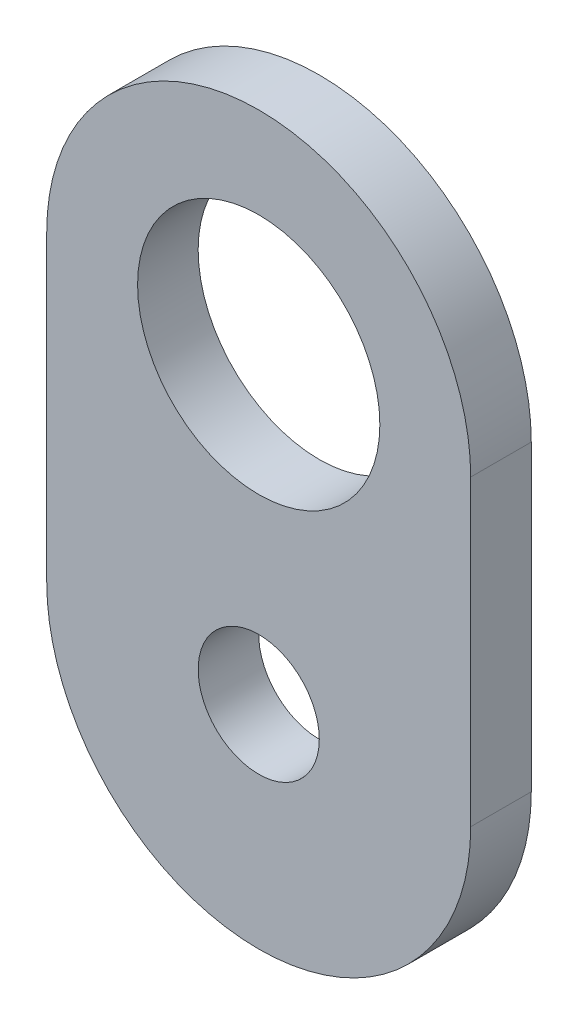
ISO-10303-21;
HEADER;
FILE_DESCRIPTION(('STEP AP214'),'2;1');
FILE_NAME('part.step','',(''),(''),'','','');
FILE_SCHEMA(('AUTOMOTIVE_DESIGN { 1 0 10303 214 1 1 1 1 }'));
ENDSEC;
DATA;
#1=APPLICATION_CONTEXT('core data for automotive mechanical design processes');
#2=APPLICATION_PROTOCOL_DEFINITION('international standard','automotive_design',2000,#1);
#3=PRODUCT_CONTEXT('',#1,'mechanical');
#4=PRODUCT('Part','Part','',(#3));
#5=PRODUCT_RELATED_PRODUCT_CATEGORY('part','',(#4));
#6=PRODUCT_DEFINITION_FORMATION('','',#4);
#7=PRODUCT_DEFINITION_CONTEXT('part definition',#1,'design');
#8=PRODUCT_DEFINITION('design','',#6,#7);
#9=PRODUCT_DEFINITION_SHAPE('','',#8);
#10=(LENGTH_UNIT() NAMED_UNIT(*) SI_UNIT(.MILLI.,.METRE.));
#11=(NAMED_UNIT(*) PLANE_ANGLE_UNIT() SI_UNIT($,.RADIAN.));
#12=(NAMED_UNIT(*) SI_UNIT($,.STERADIAN.) SOLID_ANGLE_UNIT());
#13=UNCERTAINTY_MEASURE_WITH_UNIT(LENGTH_MEASURE(1.E-05),#10,'distance_accuracy_value','');
#14=(GEOMETRIC_REPRESENTATION_CONTEXT(3) GLOBAL_UNCERTAINTY_ASSIGNED_CONTEXT((#13)) GLOBAL_UNIT_ASSIGNED_CONTEXT((#10,
#11,#12)) REPRESENTATION_CONTEXT('',''));
#15=CARTESIAN_POINT('',(0.,0.,0.));
#16=DIRECTION('',(0.,0.,1.));
#17=DIRECTION('',(1.,0.,0.));
#18=AXIS2_PLACEMENT_3D('',#15,#16,#17);
#19=CARTESIAN_POINT('',(0.,206.731564944869,12.7));
#20=DIRECTION('',(0.,0.,1.));
#21=DIRECTION('',(1.,0.,0.));
#22=AXIS2_PLACEMENT_3D('',#19,#20,#21);
#23=PLANE('',#22);
#24=CARTESIAN_POINT('',(0.,270.231564944869,12.7));
#25=DIRECTION('',(0.,0.,1.));
#26=DIRECTION('',(1.,0.,0.));
#27=AXIS2_PLACEMENT_3D('',#24,#25,#26);
#28=CIRCLE('',#27,25.4);
#29=CARTESIAN_POINT('',(25.4,270.231564944869,12.7));
#30=VERTEX_POINT('',#29);
#31=EDGE_CURVE('E117',#30,#30,#28,.T.);
#32=ORIENTED_EDGE('',*,*,#31,.F.);
#33=EDGE_LOOP('',(#32));
#34=FACE_BOUND('',#33,.T.);
#35=CARTESIAN_POINT('',(0.,206.731564944869,12.7));
#36=DIRECTION('',(0.,0.,1.));
#37=DIRECTION('',(1.,0.,0.));
#38=AXIS2_PLACEMENT_3D('',#35,#36,#37);
#39=CIRCLE('',#38,44.45);
#40=CARTESIAN_POINT('',(-44.45,206.731564944869,12.7));
#41=VERTEX_POINT('',#40);
#42=CARTESIAN_POINT('',(44.45,206.731564944869,12.7));
#43=VERTEX_POINT('',#42);
#44=EDGE_CURVE('E99',#41,#43,#39,.T.);
#45=ORIENTED_EDGE('',*,*,#44,.T.);
#46=DIRECTION('',(0.,1.,0.));
#47=VECTOR('',#46,1.);
#48=CARTESIAN_POINT('',(44.45,206.731564944869,12.7));
#49=LINE('',#48,#47);
#50=CARTESIAN_POINT('',(44.45,270.231564944869,12.7));
#51=VERTEX_POINT('',#50);
#52=EDGE_CURVE('E94',#43,#51,#49,.T.);
#53=ORIENTED_EDGE('',*,*,#52,.T.);
#54=CARTESIAN_POINT('',(0.,270.231564944869,12.7));
#55=DIRECTION('',(0.,0.,1.));
#56=DIRECTION('',(1.,0.,0.));
#57=AXIS2_PLACEMENT_3D('',#54,#55,#56);
#58=CIRCLE('',#57,44.45);
#59=CARTESIAN_POINT('',(-44.45,270.231564944869,12.7));
#60=VERTEX_POINT('',#59);
#61=EDGE_CURVE('E97',#51,#60,#58,.T.);
#62=ORIENTED_EDGE('',*,*,#61,.T.);
#63=DIRECTION('',(0.,-1.,0.));
#64=VECTOR('',#63,1.);
#65=CARTESIAN_POINT('',(-44.45,206.731564944869,12.7));
#66=LINE('',#65,#64);
#67=EDGE_CURVE('E62',#60,#41,#66,.T.);
#68=ORIENTED_EDGE('',*,*,#67,.T.);
#69=EDGE_LOOP('',(#45,#53,#62,#68));
#70=FACE_BOUND('',#69,.T.);
#71=CARTESIAN_POINT('',(0.,206.731564944869,12.7));
#72=DIRECTION('',(0.,0.,1.));
#73=DIRECTION('',(1.,0.,0.));
#74=AXIS2_PLACEMENT_3D('',#71,#72,#73);
#75=CIRCLE('',#74,12.7);
#76=CARTESIAN_POINT('',(12.7,206.731564944869,12.7));
#77=VERTEX_POINT('',#76);
#78=EDGE_CURVE('E145',#77,#77,#75,.T.);
#79=ORIENTED_EDGE('',*,*,#78,.F.);
#80=EDGE_LOOP('',(#79));
#81=FACE_BOUND('',#80,.T.);
#82=ADVANCED_FACE('F50',(#34,#70,#81),#23,.T.);
#83=CARTESIAN_POINT('',(0.,206.731564944869,0.));
#84=DIRECTION('',(0.,0.,1.));
#85=DIRECTION('',(1.,0.,0.));
#86=AXIS2_PLACEMENT_3D('',#83,#84,#85);
#87=PLANE('',#86);
#88=CARTESIAN_POINT('',(0.,206.731564944869,0.));
#89=DIRECTION('',(0.,0.,1.));
#90=DIRECTION('',(1.,0.,0.));
#91=AXIS2_PLACEMENT_3D('',#88,#89,#90);
#92=CIRCLE('',#91,44.45);
#93=CARTESIAN_POINT('',(-44.45,206.731564944869,0.));
#94=VERTEX_POINT('',#93);
#95=CARTESIAN_POINT('',(44.45,206.731564944869,0.));
#96=VERTEX_POINT('',#95);
#97=EDGE_CURVE('E118',#94,#96,#92,.T.);
#98=ORIENTED_EDGE('',*,*,#97,.F.);
#99=DIRECTION('',(0.,-1.,0.));
#100=VECTOR('',#99,1.);
#101=CARTESIAN_POINT('',(-44.45,206.731564944869,0.));
#102=LINE('',#101,#100);
#103=CARTESIAN_POINT('',(-44.45,270.231564944869,0.));
#104=VERTEX_POINT('',#103);
#105=EDGE_CURVE('E88',#104,#94,#102,.T.);
#106=ORIENTED_EDGE('',*,*,#105,.F.);
#107=CARTESIAN_POINT('',(0.,270.231564944869,0.));
#108=DIRECTION('',(0.,0.,1.));
#109=DIRECTION('',(1.,0.,0.));
#110=AXIS2_PLACEMENT_3D('',#107,#108,#109);
#111=CIRCLE('',#110,44.45);
#112=CARTESIAN_POINT('',(44.45,270.231564944869,0.));
#113=VERTEX_POINT('',#112);
#114=EDGE_CURVE('E85',#113,#104,#111,.T.);
#115=ORIENTED_EDGE('',*,*,#114,.F.);
#116=DIRECTION('',(0.,1.,0.));
#117=VECTOR('',#116,1.);
#118=CARTESIAN_POINT('',(44.45,206.731564944869,0.));
#119=LINE('',#118,#117);
#120=EDGE_CURVE('E103',#96,#113,#119,.T.);
#121=ORIENTED_EDGE('',*,*,#120,.F.);
#122=EDGE_LOOP('',(#98,#106,#115,#121));
#123=FACE_BOUND('',#122,.T.);
#124=CARTESIAN_POINT('',(0.,270.231564944869,0.));
#125=DIRECTION('',(0.,0.,1.));
#126=DIRECTION('',(1.,0.,0.));
#127=AXIS2_PLACEMENT_3D('',#124,#125,#126);
#128=CIRCLE('',#127,25.4);
#129=CARTESIAN_POINT('',(25.4,270.231564944869,0.));
#130=VERTEX_POINT('',#129);
#131=EDGE_CURVE('E138',#130,#130,#128,.T.);
#132=ORIENTED_EDGE('',*,*,#131,.T.);
#133=EDGE_LOOP('',(#132));
#134=FACE_BOUND('',#133,.T.);
#135=CARTESIAN_POINT('',(0.,206.731564944869,0.));
#136=DIRECTION('',(0.,0.,1.));
#137=DIRECTION('',(1.,0.,0.));
#138=AXIS2_PLACEMENT_3D('',#135,#136,#137);
#139=CIRCLE('',#138,12.7);
#140=CARTESIAN_POINT('',(12.7,206.731564944869,0.));
#141=VERTEX_POINT('',#140);
#142=EDGE_CURVE('E147',#141,#141,#139,.T.);
#143=ORIENTED_EDGE('',*,*,#142,.T.);
#144=EDGE_LOOP('',(#143));
#145=FACE_BOUND('',#144,.T.);
#146=ADVANCED_FACE('F133',(#123,#134,#145),#87,.F.);
#147=CARTESIAN_POINT('',(0.,206.731564944869,12.7));
#148=DIRECTION('',(0.,0.,-1.));
#149=DIRECTION('',(-1.,0.,0.));
#150=AXIS2_PLACEMENT_3D('',#147,#148,#149);
#151=CYLINDRICAL_SURFACE('',#150,44.45);
#152=ORIENTED_EDGE('',*,*,#97,.T.);
#153=DIRECTION('',(0.,0.,-1.));
#154=VECTOR('',#153,1.);
#155=CARTESIAN_POINT('',(44.45,206.731564944869,12.7));
#156=LINE('',#155,#154);
#157=EDGE_CURVE('E12',#43,#96,#156,.T.);
#158=ORIENTED_EDGE('',*,*,#157,.F.);
#159=ORIENTED_EDGE('',*,*,#44,.F.);
#160=DIRECTION('',(0.,0.,-1.));
#161=VECTOR('',#160,1.);
#162=CARTESIAN_POINT('',(-44.45,206.731564944869,12.7));
#163=LINE('',#162,#161);
#164=EDGE_CURVE('E115',#41,#94,#163,.T.);
#165=ORIENTED_EDGE('',*,*,#164,.T.);
#166=EDGE_LOOP('',(#152,#158,#159,#165));
#167=FACE_BOUND('',#166,.T.);
#168=ADVANCED_FACE('F47',(#167),#151,.T.);
#169=CARTESIAN_POINT('',(44.45,206.731564944869,12.7));
#170=DIRECTION('',(-1.,0.,0.));
#171=DIRECTION('',(0.,0.,1.));
#172=AXIS2_PLACEMENT_3D('',#169,#170,#171);
#173=PLANE('',#172);
#174=ORIENTED_EDGE('',*,*,#120,.T.);
#175=DIRECTION('',(0.,0.,-1.));
#176=VECTOR('',#175,1.);
#177=CARTESIAN_POINT('',(44.45,270.231564944869,12.7));
#178=LINE('',#177,#176);
#179=EDGE_CURVE('E60',#51,#113,#178,.T.);
#180=ORIENTED_EDGE('',*,*,#179,.F.);
#181=ORIENTED_EDGE('',*,*,#52,.F.);
#182=ORIENTED_EDGE('',*,*,#157,.T.);
#183=EDGE_LOOP('',(#174,#180,#181,#182));
#184=FACE_BOUND('',#183,.T.);
#185=ADVANCED_FACE('F101',(#184),#173,.F.);
#186=CARTESIAN_POINT('',(0.,270.231564944869,12.7));
#187=DIRECTION('',(0.,0.,-1.));
#188=DIRECTION('',(-1.,0.,0.));
#189=AXIS2_PLACEMENT_3D('',#186,#187,#188);
#190=CYLINDRICAL_SURFACE('',#189,44.45);
#191=ORIENTED_EDGE('',*,*,#114,.T.);
#192=DIRECTION('',(0.,0.,-1.));
#193=VECTOR('',#192,1.);
#194=CARTESIAN_POINT('',(-44.45,270.231564944869,12.7));
#195=LINE('',#194,#193);
#196=EDGE_CURVE('E110',#60,#104,#195,.T.);
#197=ORIENTED_EDGE('',*,*,#196,.F.);
#198=ORIENTED_EDGE('',*,*,#61,.F.);
#199=ORIENTED_EDGE('',*,*,#179,.T.);
#200=EDGE_LOOP('',(#191,#197,#198,#199));
#201=FACE_BOUND('',#200,.T.);
#202=ADVANCED_FACE('F106',(#201),#190,.T.);
#203=CARTESIAN_POINT('',(-44.45,206.731564944869,12.7));
#204=DIRECTION('',(1.,0.,0.));
#205=DIRECTION('',(0.,0.,-1.));
#206=AXIS2_PLACEMENT_3D('',#203,#204,#205);
#207=PLANE('',#206);
#208=ORIENTED_EDGE('',*,*,#105,.T.);
#209=ORIENTED_EDGE('',*,*,#164,.F.);
#210=ORIENTED_EDGE('',*,*,#67,.F.);
#211=ORIENTED_EDGE('',*,*,#196,.T.);
#212=EDGE_LOOP('',(#208,#209,#210,#211));
#213=FACE_BOUND('',#212,.T.);
#214=ADVANCED_FACE('F127',(#213),#207,.F.);
#215=CARTESIAN_POINT('',(0.,270.231564944869,12.7));
#216=DIRECTION('',(0.,0.,-1.));
#217=DIRECTION('',(-1.,0.,0.));
#218=AXIS2_PLACEMENT_3D('',#215,#216,#217);
#219=CYLINDRICAL_SURFACE('',#218,25.4);
#220=ORIENTED_EDGE('',*,*,#31,.T.);
#221=EDGE_LOOP('',(#220));
#222=FACE_BOUND('',#221,.T.);
#223=ORIENTED_EDGE('',*,*,#131,.F.);
#224=EDGE_LOOP('',(#223));
#225=FACE_BOUND('',#224,.T.);
#226=ADVANCED_FACE('F162',(#222,#225),#219,.F.);
#227=CARTESIAN_POINT('',(0.,206.731564944869,12.7));
#228=DIRECTION('',(0.,0.,-1.));
#229=DIRECTION('',(-1.,0.,0.));
#230=AXIS2_PLACEMENT_3D('',#227,#228,#229);
#231=CYLINDRICAL_SURFACE('',#230,12.7);
#232=ORIENTED_EDGE('',*,*,#78,.T.);
#233=EDGE_LOOP('',(#232));
#234=FACE_BOUND('',#233,.T.);
#235=ORIENTED_EDGE('',*,*,#142,.F.);
#236=EDGE_LOOP('',(#235));
#237=FACE_BOUND('',#236,.T.);
#238=ADVANCED_FACE('F154',(#234,#237),#231,.F.);
#239=CLOSED_SHELL('',(#82,#146,#168,#185,#202,#214,#226,#238));
#240=MANIFOLD_SOLID_BREP('B2',#239);
#241=ADVANCED_BREP_SHAPE_REPRESENTATION('',(#18,#240),#14);
#242=SHAPE_DEFINITION_REPRESENTATION(#9,#241);
ENDSEC;
END-ISO-10303-21;
